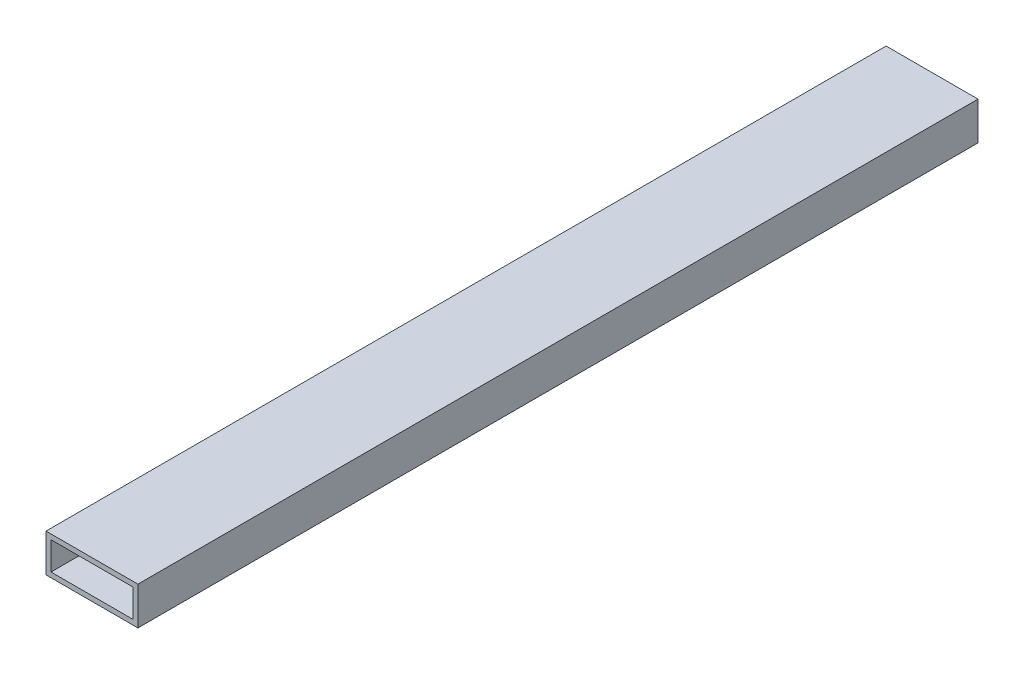
ISO-10303-21;
HEADER;
FILE_DESCRIPTION(('STEP AP214'),'2;1');
FILE_NAME('part.step','',(''),(''),'','','');
FILE_SCHEMA(('AUTOMOTIVE_DESIGN { 1 0 10303 214 1 1 1 1 }'));
ENDSEC;
DATA;
#1=APPLICATION_CONTEXT('core data for automotive mechanical design processes');
#2=APPLICATION_PROTOCOL_DEFINITION('international standard','automotive_design',2000,#1);
#3=PRODUCT_CONTEXT('',#1,'mechanical');
#4=PRODUCT('Part','Part','',(#3));
#5=PRODUCT_RELATED_PRODUCT_CATEGORY('part','',(#4));
#6=PRODUCT_DEFINITION_FORMATION('','',#4);
#7=PRODUCT_DEFINITION_CONTEXT('part definition',#1,'design');
#8=PRODUCT_DEFINITION('design','',#6,#7);
#9=PRODUCT_DEFINITION_SHAPE('','',#8);
#10=(LENGTH_UNIT() NAMED_UNIT(*) SI_UNIT(.MILLI.,.METRE.));
#11=(NAMED_UNIT(*) PLANE_ANGLE_UNIT() SI_UNIT($,.RADIAN.));
#12=(NAMED_UNIT(*) SI_UNIT($,.STERADIAN.) SOLID_ANGLE_UNIT());
#13=UNCERTAINTY_MEASURE_WITH_UNIT(LENGTH_MEASURE(1.E-05),#10,'distance_accuracy_value','');
#14=(GEOMETRIC_REPRESENTATION_CONTEXT(3) GLOBAL_UNCERTAINTY_ASSIGNED_CONTEXT((#13)) GLOBAL_UNIT_ASSIGNED_CONTEXT((#10,
#11,#12)) REPRESENTATION_CONTEXT('',''));
#15=CARTESIAN_POINT('',(0.,0.,0.));
#16=DIRECTION('',(0.,0.,1.));
#17=DIRECTION('',(1.,0.,0.));
#18=AXIS2_PLACEMENT_3D('',#15,#16,#17);
#19=CARTESIAN_POINT('',(49.0000000006869,0.,841.));
#20=DIRECTION('',(1.,0.,0.));
#21=DIRECTION('',(0.,0.,-1.));
#22=AXIS2_PLACEMENT_3D('',#19,#20,#21);
#23=PLANE('',#22);
#24=DIRECTION('',(0.,-1.,0.));
#25=VECTOR('',#24,1.);
#26=CARTESIAN_POINT('',(49.0000000006869,0.,0.));
#27=LINE('',#26,#25);
#28=CARTESIAN_POINT('',(49.0000000006869,23.7999999965299,0.));
#29=VERTEX_POINT('',#28);
#30=CARTESIAN_POINT('',(49.0000000006869,-4.20000000347008,0.));
#31=VERTEX_POINT('',#30);
#32=EDGE_CURVE('E159',#29,#31,#27,.T.);
#33=ORIENTED_EDGE('',*,*,#32,.F.);
#34=DIRECTION('',(0.,0.,-1.));
#35=VECTOR('',#34,1.);
#36=CARTESIAN_POINT('',(49.0000000006869,23.7999999965299,841.));
#37=LINE('',#36,#35);
#38=CARTESIAN_POINT('',(49.0000000006869,23.7999999965299,841.));
#39=VERTEX_POINT('',#38);
#40=EDGE_CURVE('E11',#39,#29,#37,.T.);
#41=ORIENTED_EDGE('',*,*,#40,.F.);
#42=DIRECTION('',(0.,-1.,0.));
#43=VECTOR('',#42,1.);
#44=CARTESIAN_POINT('',(49.0000000006869,0.,841.));
#45=LINE('',#44,#43);
#46=CARTESIAN_POINT('',(49.0000000006869,-4.20000000347008,841.));
#47=VERTEX_POINT('',#46);
#48=EDGE_CURVE('E130',#39,#47,#45,.T.);
#49=ORIENTED_EDGE('',*,*,#48,.T.);
#50=DIRECTION('',(0.,0.,-1.));
#51=VECTOR('',#50,1.);
#52=CARTESIAN_POINT('',(49.0000000006869,-4.20000000347008,841.));
#53=LINE('',#52,#51);
#54=EDGE_CURVE('E64',#47,#31,#53,.T.);
#55=ORIENTED_EDGE('',*,*,#54,.T.);
#56=EDGE_LOOP('',(#33,#41,#49,#55));
#57=FACE_BOUND('',#56,.T.);
#58=ADVANCED_FACE('F45',(#57),#23,.T.);
#59=CARTESIAN_POINT('',(0.,23.7999999965299,841.));
#60=DIRECTION('',(0.,1.,0.));
#61=DIRECTION('',(-1.,0.,0.));
#62=AXIS2_PLACEMENT_3D('',#59,#60,#61);
#63=PLANE('',#62);
#64=DIRECTION('',(1.,0.,0.));
#65=VECTOR('',#64,1.);
#66=CARTESIAN_POINT('',(0.,23.7999999965299,0.));
#67=LINE('',#66,#65);
#68=CARTESIAN_POINT('',(131.000000000687,23.7999999965299,0.));
#69=VERTEX_POINT('',#68);
#70=EDGE_CURVE('E135',#29,#69,#67,.T.);
#71=ORIENTED_EDGE('',*,*,#70,.T.);
#72=DIRECTION('',(0.,0.,-1.));
#73=VECTOR('',#72,1.);
#74=CARTESIAN_POINT('',(131.000000000687,23.7999999965299,841.));
#75=LINE('',#74,#73);
#76=CARTESIAN_POINT('',(131.000000000687,23.7999999965299,841.));
#77=VERTEX_POINT('',#76);
#78=EDGE_CURVE('E55',#77,#69,#75,.T.);
#79=ORIENTED_EDGE('',*,*,#78,.F.);
#80=DIRECTION('',(1.,0.,0.));
#81=VECTOR('',#80,1.);
#82=CARTESIAN_POINT('',(0.,23.7999999965299,841.));
#83=LINE('',#82,#81);
#84=EDGE_CURVE('E125',#39,#77,#83,.T.);
#85=ORIENTED_EDGE('',*,*,#84,.F.);
#86=ORIENTED_EDGE('',*,*,#40,.T.);
#87=EDGE_LOOP('',(#71,#79,#85,#86));
#88=FACE_BOUND('',#87,.T.);
#89=ADVANCED_FACE('F133',(#88),#63,.F.);
#90=CARTESIAN_POINT('',(131.000000000687,0.,841.));
#91=DIRECTION('',(1.,0.,0.));
#92=DIRECTION('',(0.,0.,-1.));
#93=AXIS2_PLACEMENT_3D('',#90,#91,#92);
#94=PLANE('',#93);
#95=DIRECTION('',(0.,-1.,0.));
#96=VECTOR('',#95,1.);
#97=CARTESIAN_POINT('',(131.000000000687,0.,0.));
#98=LINE('',#97,#96);
#99=CARTESIAN_POINT('',(131.000000000687,-4.20000000347007,0.));
#100=VERTEX_POINT('',#99);
#101=EDGE_CURVE('E156',#69,#100,#98,.T.);
#102=ORIENTED_EDGE('',*,*,#101,.T.);
#103=DIRECTION('',(0.,0.,-1.));
#104=VECTOR('',#103,1.);
#105=CARTESIAN_POINT('',(131.000000000687,-4.20000000347007,841.));
#106=LINE('',#105,#104);
#107=CARTESIAN_POINT('',(131.000000000687,-4.20000000347007,841.));
#108=VERTEX_POINT('',#107);
#109=EDGE_CURVE('E90',#108,#100,#106,.T.);
#110=ORIENTED_EDGE('',*,*,#109,.F.);
#111=DIRECTION('',(0.,-1.,0.));
#112=VECTOR('',#111,1.);
#113=CARTESIAN_POINT('',(131.000000000687,0.,841.));
#114=LINE('',#113,#112);
#115=EDGE_CURVE('E117',#77,#108,#114,.T.);
#116=ORIENTED_EDGE('',*,*,#115,.F.);
#117=ORIENTED_EDGE('',*,*,#78,.T.);
#118=EDGE_LOOP('',(#102,#110,#116,#117));
#119=FACE_BOUND('',#118,.T.);
#120=ADVANCED_FACE('F119',(#119),#94,.F.);
#121=CARTESIAN_POINT('',(136.000000000687,0.,841.));
#122=DIRECTION('',(1.,0.,0.));
#123=DIRECTION('',(0.,0.,-1.));
#124=AXIS2_PLACEMENT_3D('',#121,#122,#123);
#125=PLANE('',#124);
#126=DIRECTION('',(0.,-1.,0.));
#127=VECTOR('',#126,1.);
#128=CARTESIAN_POINT('',(136.000000000687,0.,0.));
#129=LINE('',#128,#127);
#130=CARTESIAN_POINT('',(136.000000000687,28.7999999965299,0.));
#131=VERTEX_POINT('',#130);
#132=CARTESIAN_POINT('',(136.000000000687,-9.20000000347008,0.));
#133=VERTEX_POINT('',#132);
#134=EDGE_CURVE('E169',#131,#133,#129,.T.);
#135=ORIENTED_EDGE('',*,*,#134,.F.);
#136=DIRECTION('',(0.,0.,-1.));
#137=VECTOR('',#136,1.);
#138=CARTESIAN_POINT('',(136.000000000687,28.7999999965299,841.));
#139=LINE('',#138,#137);
#140=CARTESIAN_POINT('',(136.000000000687,28.7999999965299,841.));
#141=VERTEX_POINT('',#140);
#142=EDGE_CURVE('E49',#141,#131,#139,.T.);
#143=ORIENTED_EDGE('',*,*,#142,.F.);
#144=DIRECTION('',(0.,-1.,0.));
#145=VECTOR('',#144,1.);
#146=CARTESIAN_POINT('',(136.000000000687,0.,841.));
#147=LINE('',#146,#145);
#148=CARTESIAN_POINT('',(136.000000000687,-9.20000000347008,841.));
#149=VERTEX_POINT('',#148);
#150=EDGE_CURVE('E155',#141,#149,#147,.T.);
#151=ORIENTED_EDGE('',*,*,#150,.T.);
#152=DIRECTION('',(0.,0.,-1.));
#153=VECTOR('',#152,1.);
#154=CARTESIAN_POINT('',(136.000000000687,-9.20000000347008,841.));
#155=LINE('',#154,#153);
#156=EDGE_CURVE('E140',#149,#133,#155,.T.);
#157=ORIENTED_EDGE('',*,*,#156,.T.);
#158=EDGE_LOOP('',(#135,#143,#151,#157));
#159=FACE_BOUND('',#158,.T.);
#160=ADVANCED_FACE('F47',(#159),#125,.T.);
#161=CARTESIAN_POINT('',(0.,28.7999999965299,841.));
#162=DIRECTION('',(0.,1.,0.));
#163=DIRECTION('',(0.,0.,1.));
#164=AXIS2_PLACEMENT_3D('',#161,#162,#163);
#165=PLANE('',#164);
#166=DIRECTION('',(1.,0.,0.));
#167=VECTOR('',#166,1.);
#168=CARTESIAN_POINT('',(0.,28.7999999965299,0.));
#169=LINE('',#168,#167);
#170=CARTESIAN_POINT('',(44.0000000006869,28.7999999965299,0.));
#171=VERTEX_POINT('',#170);
#172=EDGE_CURVE('E166',#171,#131,#169,.T.);
#173=ORIENTED_EDGE('',*,*,#172,.F.);
#174=DIRECTION('',(0.,0.,-1.));
#175=VECTOR('',#174,1.);
#176=CARTESIAN_POINT('',(44.0000000006869,28.7999999965299,841.));
#177=LINE('',#176,#175);
#178=CARTESIAN_POINT('',(44.0000000006869,28.7999999965299,841.));
#179=VERTEX_POINT('',#178);
#180=EDGE_CURVE('E144',#179,#171,#177,.T.);
#181=ORIENTED_EDGE('',*,*,#180,.F.);
#182=DIRECTION('',(1.,0.,0.));
#183=VECTOR('',#182,1.);
#184=CARTESIAN_POINT('',(0.,28.7999999965299,841.));
#185=LINE('',#184,#183);
#186=EDGE_CURVE('E178',#179,#141,#185,.T.);
#187=ORIENTED_EDGE('',*,*,#186,.T.);
#188=ORIENTED_EDGE('',*,*,#142,.T.);
#189=EDGE_LOOP('',(#173,#181,#187,#188));
#190=FACE_BOUND('',#189,.T.);
#191=ADVANCED_FACE('F184',(#190),#165,.T.);
#192=CARTESIAN_POINT('',(44.0000000006869,0.,841.));
#193=DIRECTION('',(1.,0.,0.));
#194=DIRECTION('',(0.,1.,0.));
#195=AXIS2_PLACEMENT_3D('',#192,#193,#194);
#196=PLANE('',#195);
#197=DIRECTION('',(0.,-1.,0.));
#198=VECTOR('',#197,1.);
#199=CARTESIAN_POINT('',(44.0000000006869,0.,0.));
#200=LINE('',#199,#198);
#201=CARTESIAN_POINT('',(44.0000000006869,-9.20000000347008,0.));
#202=VERTEX_POINT('',#201);
#203=EDGE_CURVE('E164',#171,#202,#200,.T.);
#204=ORIENTED_EDGE('',*,*,#203,.T.);
#205=DIRECTION('',(0.,0.,-1.));
#206=VECTOR('',#205,1.);
#207=CARTESIAN_POINT('',(44.0000000006869,-9.20000000347008,841.));
#208=LINE('',#207,#206);
#209=CARTESIAN_POINT('',(44.0000000006869,-9.20000000347008,841.));
#210=VERTEX_POINT('',#209);
#211=EDGE_CURVE('E142',#210,#202,#208,.T.);
#212=ORIENTED_EDGE('',*,*,#211,.F.);
#213=DIRECTION('',(0.,-1.,0.));
#214=VECTOR('',#213,1.);
#215=CARTESIAN_POINT('',(44.0000000006869,0.,841.));
#216=LINE('',#215,#214);
#217=EDGE_CURVE('E176',#179,#210,#216,.T.);
#218=ORIENTED_EDGE('',*,*,#217,.F.);
#219=ORIENTED_EDGE('',*,*,#180,.T.);
#220=EDGE_LOOP('',(#204,#212,#218,#219));
#221=FACE_BOUND('',#220,.T.);
#222=ADVANCED_FACE('F186',(#221),#196,.F.);
#223=CARTESIAN_POINT('',(0.,-9.20000000347008,841.));
#224=DIRECTION('',(0.,1.,0.));
#225=DIRECTION('',(-1.,0.,0.));
#226=AXIS2_PLACEMENT_3D('',#223,#224,#225);
#227=PLANE('',#226);
#228=DIRECTION('',(1.,0.,0.));
#229=VECTOR('',#228,1.);
#230=CARTESIAN_POINT('',(0.,-9.20000000347008,0.));
#231=LINE('',#230,#229);
#232=EDGE_CURVE('E161',#202,#133,#231,.T.);
#233=ORIENTED_EDGE('',*,*,#232,.T.);
#234=ORIENTED_EDGE('',*,*,#156,.F.);
#235=DIRECTION('',(1.,0.,0.));
#236=VECTOR('',#235,1.);
#237=CARTESIAN_POINT('',(0.,-9.20000000347008,841.));
#238=LINE('',#237,#236);
#239=EDGE_CURVE('E174',#210,#149,#238,.T.);
#240=ORIENTED_EDGE('',*,*,#239,.F.);
#241=ORIENTED_EDGE('',*,*,#211,.T.);
#242=EDGE_LOOP('',(#233,#234,#240,#241));
#243=FACE_BOUND('',#242,.T.);
#244=ADVANCED_FACE('F189',(#243),#227,.F.);
#245=CARTESIAN_POINT('',(0.,-4.20000000347008,841.));
#246=DIRECTION('',(0.,1.,0.));
#247=DIRECTION('',(-1.,0.,0.));
#248=AXIS2_PLACEMENT_3D('',#245,#246,#247);
#249=PLANE('',#248);
#250=DIRECTION('',(1.,0.,0.));
#251=VECTOR('',#250,1.);
#252=CARTESIAN_POINT('',(0.,-4.20000000347008,0.));
#253=LINE('',#252,#251);
#254=EDGE_CURVE('E152',#31,#100,#253,.T.);
#255=ORIENTED_EDGE('',*,*,#254,.F.);
#256=ORIENTED_EDGE('',*,*,#54,.F.);
#257=DIRECTION('',(1.,0.,0.));
#258=VECTOR('',#257,1.);
#259=CARTESIAN_POINT('',(0.,-4.20000000347008,841.));
#260=LINE('',#259,#258);
#261=EDGE_CURVE('E124',#47,#108,#260,.T.);
#262=ORIENTED_EDGE('',*,*,#261,.T.);
#263=ORIENTED_EDGE('',*,*,#109,.T.);
#264=EDGE_LOOP('',(#255,#256,#262,#263));
#265=FACE_BOUND('',#264,.T.);
#266=ADVANCED_FACE('F195',(#265),#249,.T.);
#267=CARTESIAN_POINT('',(0.,0.,841.));
#268=DIRECTION('',(0.,0.,1.));
#269=DIRECTION('',(1.,0.,0.));
#270=AXIS2_PLACEMENT_3D('',#267,#268,#269);
#271=PLANE('',#270);
#272=ORIENTED_EDGE('',*,*,#150,.F.);
#273=ORIENTED_EDGE('',*,*,#186,.F.);
#274=ORIENTED_EDGE('',*,*,#217,.T.);
#275=ORIENTED_EDGE('',*,*,#239,.T.);
#276=EDGE_LOOP('',(#272,#273,#274,#275));
#277=FACE_BOUND('',#276,.T.);
#278=ORIENTED_EDGE('',*,*,#48,.F.);
#279=ORIENTED_EDGE('',*,*,#84,.T.);
#280=ORIENTED_EDGE('',*,*,#115,.T.);
#281=ORIENTED_EDGE('',*,*,#261,.F.);
#282=EDGE_LOOP('',(#278,#279,#280,#281));
#283=FACE_BOUND('',#282,.T.);
#284=ADVANCED_FACE('F129',(#277,#283),#271,.T.);
#285=CARTESIAN_POINT('',(0.,0.,0.));
#286=DIRECTION('',(0.,0.,1.));
#287=DIRECTION('',(1.,0.,0.));
#288=AXIS2_PLACEMENT_3D('',#285,#286,#287);
#289=PLANE('',#288);
#290=ORIENTED_EDGE('',*,*,#134,.T.);
#291=ORIENTED_EDGE('',*,*,#232,.F.);
#292=ORIENTED_EDGE('',*,*,#203,.F.);
#293=ORIENTED_EDGE('',*,*,#172,.T.);
#294=EDGE_LOOP('',(#290,#291,#292,#293));
#295=FACE_BOUND('',#294,.T.);
#296=ORIENTED_EDGE('',*,*,#32,.T.);
#297=ORIENTED_EDGE('',*,*,#254,.T.);
#298=ORIENTED_EDGE('',*,*,#101,.F.);
#299=ORIENTED_EDGE('',*,*,#70,.F.);
#300=EDGE_LOOP('',(#296,#297,#298,#299));
#301=FACE_BOUND('',#300,.T.);
#302=ADVANCED_FACE('F191',(#295,#301),#289,.F.);
#303=CLOSED_SHELL('',(#58,#89,#120,#160,#191,#222,#244,#266,#284,#302));
#304=MANIFOLD_SOLID_BREP('B2',#303);
#305=ADVANCED_BREP_SHAPE_REPRESENTATION('',(#18,#304),#14);
#306=SHAPE_DEFINITION_REPRESENTATION(#9,#305);
ENDSEC;
END-ISO-10303-21;
